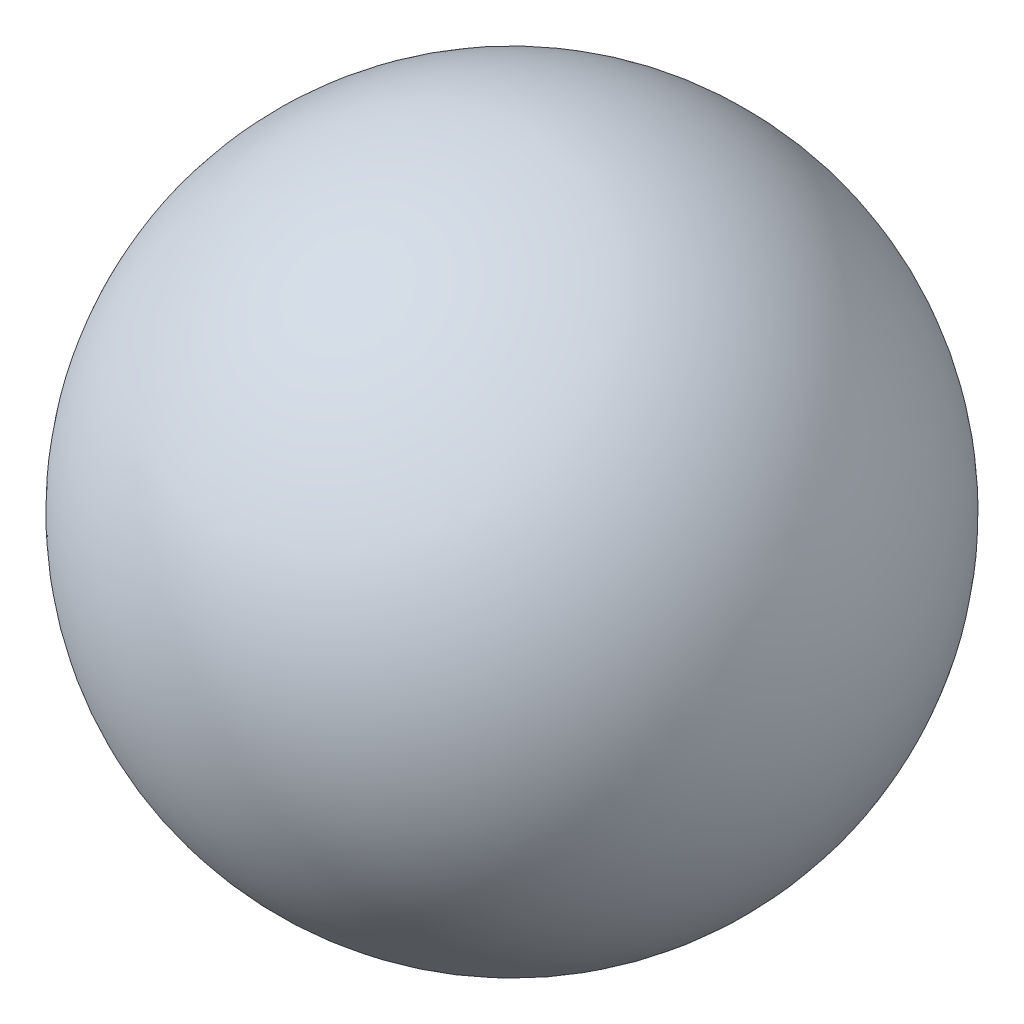
ISO-10303-21;
HEADER;
FILE_DESCRIPTION(('STEP AP214'),'2;1');
FILE_NAME('part.step','',(''),(''),'','','');
FILE_SCHEMA(('AUTOMOTIVE_DESIGN { 1 0 10303 214 1 1 1 1 }'));
ENDSEC;
DATA;
#1=APPLICATION_CONTEXT('core data for automotive mechanical design processes');
#2=APPLICATION_PROTOCOL_DEFINITION('international standard','automotive_design',2000,#1);
#3=PRODUCT_CONTEXT('',#1,'mechanical');
#4=PRODUCT('Part','Part','',(#3));
#5=PRODUCT_RELATED_PRODUCT_CATEGORY('part','',(#4));
#6=PRODUCT_DEFINITION_FORMATION('','',#4);
#7=PRODUCT_DEFINITION_CONTEXT('part definition',#1,'design');
#8=PRODUCT_DEFINITION('design','',#6,#7);
#9=PRODUCT_DEFINITION_SHAPE('','',#8);
#10=(LENGTH_UNIT() NAMED_UNIT(*) SI_UNIT(.MILLI.,.METRE.));
#11=(NAMED_UNIT(*) PLANE_ANGLE_UNIT() SI_UNIT($,.RADIAN.));
#12=(NAMED_UNIT(*) SI_UNIT($,.STERADIAN.) SOLID_ANGLE_UNIT());
#13=UNCERTAINTY_MEASURE_WITH_UNIT(LENGTH_MEASURE(1.E-05),#10,'distance_accuracy_value','');
#14=(GEOMETRIC_REPRESENTATION_CONTEXT(3) GLOBAL_UNCERTAINTY_ASSIGNED_CONTEXT((#13)) GLOBAL_UNIT_ASSIGNED_CONTEXT((#10,
#11,#12)) REPRESENTATION_CONTEXT('',''));
#15=CARTESIAN_POINT('',(0.,0.,0.));
#16=DIRECTION('',(0.,0.,1.));
#17=DIRECTION('',(1.,0.,0.));
#18=AXIS2_PLACEMENT_3D('',#15,#16,#17);
#19=CARTESIAN_POINT('',(0.,0.,0.));
#20=DIRECTION('',(-1.,0.,0.));
#21=DIRECTION('',(0.,1.,0.));
#22=AXIS2_PLACEMENT_3D('',#19,#20,#21);
#23=SPHERICAL_SURFACE('',#22,6.95844);
#24=CARTESIAN_POINT('',(-6.95844,0.,0.));
#25=VERTEX_POINT('',#24);
#26=VERTEX_LOOP('',#25);
#27=FACE_BOUND('',#26,.T.);
#28=ADVANCED_FACE('F32',(#27),#23,.T.);
#29=CLOSED_SHELL('',(#28));
#30=MANIFOLD_SOLID_BREP('B2',#29);
#31=ADVANCED_BREP_SHAPE_REPRESENTATION('',(#18,#30),#14);
#32=SHAPE_DEFINITION_REPRESENTATION(#9,#31);
ENDSEC;
END-ISO-10303-21;
